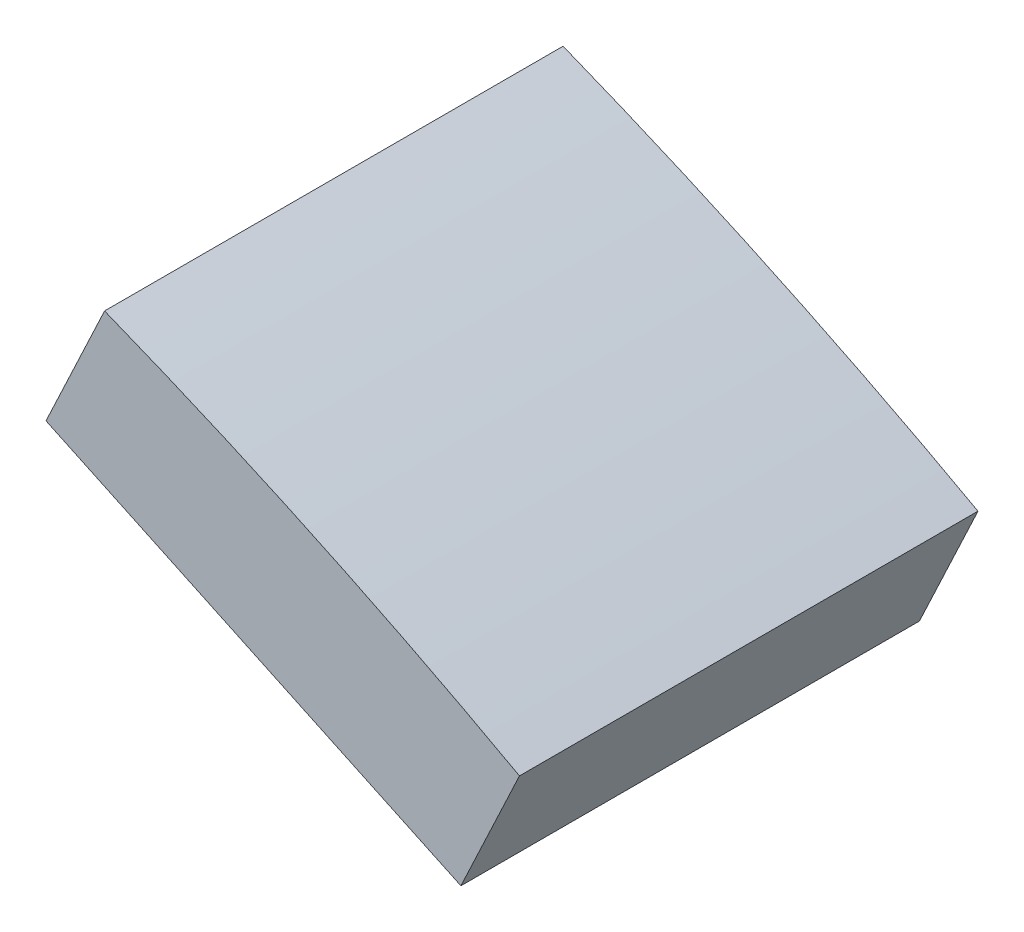
ISO-10303-21;
HEADER;
FILE_DESCRIPTION(('STEP AP214'),'2;1');
FILE_NAME('part.step','',(''),(''),'','','');
FILE_SCHEMA(('AUTOMOTIVE_DESIGN { 1 0 10303 214 1 1 1 1 }'));
ENDSEC;
DATA;
#1=APPLICATION_CONTEXT('core data for automotive mechanical design processes');
#2=APPLICATION_PROTOCOL_DEFINITION('international standard','automotive_design',2000,#1);
#3=PRODUCT_CONTEXT('',#1,'mechanical');
#4=PRODUCT('Part','Part','',(#3));
#5=PRODUCT_RELATED_PRODUCT_CATEGORY('part','',(#4));
#6=PRODUCT_DEFINITION_FORMATION('','',#4);
#7=PRODUCT_DEFINITION_CONTEXT('part definition',#1,'design');
#8=PRODUCT_DEFINITION('design','',#6,#7);
#9=PRODUCT_DEFINITION_SHAPE('','',#8);
#10=(LENGTH_UNIT() NAMED_UNIT(*) SI_UNIT(.MILLI.,.METRE.));
#11=(NAMED_UNIT(*) PLANE_ANGLE_UNIT() SI_UNIT($,.RADIAN.));
#12=(NAMED_UNIT(*) SI_UNIT($,.STERADIAN.) SOLID_ANGLE_UNIT());
#13=UNCERTAINTY_MEASURE_WITH_UNIT(LENGTH_MEASURE(1.E-05),#10,'distance_accuracy_value','');
#14=(GEOMETRIC_REPRESENTATION_CONTEXT(3) GLOBAL_UNCERTAINTY_ASSIGNED_CONTEXT((#13)) GLOBAL_UNIT_ASSIGNED_CONTEXT((#10,
#11,#12)) REPRESENTATION_CONTEXT('',''));
#15=CARTESIAN_POINT('',(0.,0.,0.));
#16=DIRECTION('',(0.,0.,1.));
#17=DIRECTION('',(1.,0.,0.));
#18=AXIS2_PLACEMENT_3D('',#15,#16,#17);
#19=CARTESIAN_POINT('',(0.,0.,12.7));
#20=DIRECTION('',(0.,0.,-1.));
#21=DIRECTION('',(-1.,0.,0.));
#22=AXIS2_PLACEMENT_3D('',#19,#20,#21);
#23=CYLINDRICAL_SURFACE('',#22,101.6);
#24=CARTESIAN_POINT('',(0.,0.,0.));
#25=DIRECTION('',(0.,0.,1.));
#26=DIRECTION('',(-1.,0.,0.));
#27=AXIS2_PLACEMENT_3D('',#24,#25,#26);
#28=CIRCLE('',#27,101.6);
#29=CARTESIAN_POINT('',(48.9158522480333,89.0494211033883,0.));
#30=VERTEX_POINT('',#29);
#31=CARTESIAN_POINT('',(37.4242813683509,94.45625,0.));
#32=VERTEX_POINT('',#31);
#33=EDGE_CURVE('E96',#30,#32,#28,.T.);
#34=ORIENTED_EDGE('',*,*,#33,.T.);
#35=DIRECTION('',(0.,0.,-1.));
#36=VECTOR('',#35,1.);
#37=CARTESIAN_POINT('',(37.4242813683509,94.45625,12.7));
#38=LINE('',#37,#36);
#39=CARTESIAN_POINT('',(37.4242813683509,94.45625,12.7));
#40=VERTEX_POINT('',#39);
#41=EDGE_CURVE('E11',#40,#32,#38,.T.);
#42=ORIENTED_EDGE('',*,*,#41,.F.);
#43=CARTESIAN_POINT('',(0.,0.,12.7));
#44=DIRECTION('',(0.,0.,1.));
#45=DIRECTION('',(-1.,0.,0.));
#46=AXIS2_PLACEMENT_3D('',#43,#44,#45);
#47=CIRCLE('',#46,101.6);
#48=CARTESIAN_POINT('',(48.9158522480333,89.0494211033883,12.7));
#49=VERTEX_POINT('',#48);
#50=EDGE_CURVE('E84',#49,#40,#47,.T.);
#51=ORIENTED_EDGE('',*,*,#50,.F.);
#52=DIRECTION('',(0.,0.,-1.));
#53=VECTOR('',#52,1.);
#54=CARTESIAN_POINT('',(48.9158522480333,89.0494211033883,12.7));
#55=LINE('',#54,#53);
#56=EDGE_CURVE('E92',#49,#30,#55,.T.);
#57=ORIENTED_EDGE('',*,*,#56,.T.);
#58=EDGE_LOOP('',(#34,#42,#51,#57));
#59=FACE_BOUND('',#58,.T.);
#60=ADVANCED_FACE('F33',(#59),#23,.T.);
#61=CARTESIAN_POINT('',(37.4242813683509,94.45625,12.7));
#62=DIRECTION('',(0.904848100762394,-0.425734558788324,0.));
#63=DIRECTION('',(0.425734558788324,0.904848100762394,0.));
#64=AXIS2_PLACEMENT_3D('',#61,#62,#63);
#65=PLANE('',#64);
#66=DIRECTION('',(-0.425734558788324,-0.904848100762394,0.));
#67=VECTOR('',#66,1.);
#68=CARTESIAN_POINT('',(37.4242813683509,94.45625,0.));
#69=LINE('',#68,#67);
#70=CARTESIAN_POINT('',(35.8022326993674,91.0087787360953,0.));
#71=VERTEX_POINT('',#70);
#72=EDGE_CURVE('E88',#32,#71,#69,.T.);
#73=ORIENTED_EDGE('',*,*,#72,.T.);
#74=DIRECTION('',(0.,0.,-1.));
#75=VECTOR('',#74,1.);
#76=CARTESIAN_POINT('',(35.8022326993674,91.0087787360953,12.7));
#77=LINE('',#76,#75);
#78=CARTESIAN_POINT('',(35.8022326993674,91.0087787360953,12.7));
#79=VERTEX_POINT('',#78);
#80=EDGE_CURVE('E41',#79,#71,#77,.T.);
#81=ORIENTED_EDGE('',*,*,#80,.F.);
#82=DIRECTION('',(-0.425734558788324,-0.904848100762394,0.));
#83=VECTOR('',#82,1.);
#84=CARTESIAN_POINT('',(37.4242813683509,94.45625,12.7));
#85=LINE('',#84,#83);
#86=EDGE_CURVE('E79',#40,#79,#85,.T.);
#87=ORIENTED_EDGE('',*,*,#86,.F.);
#88=ORIENTED_EDGE('',*,*,#41,.T.);
#89=EDGE_LOOP('',(#73,#81,#87,#88));
#90=FACE_BOUND('',#89,.T.);
#91=ADVANCED_FACE('F87',(#90),#65,.F.);
#92=CARTESIAN_POINT('',(35.8022326993674,91.0087787360953,12.7));
#93=DIRECTION('',(0.425734558788324,0.904848100762394,0.));
#94=DIRECTION('',(-0.904848100762394,0.425734558788324,0.));
#95=AXIS2_PLACEMENT_3D('',#92,#93,#94);
#96=PLANE('',#95);
#97=DIRECTION('',(0.904848100762394,-0.425734558788324,0.));
#98=VECTOR('',#97,1.);
#99=CARTESIAN_POINT('',(35.8022326993674,91.0087787360953,0.));
#100=LINE('',#99,#98);
#101=CARTESIAN_POINT('',(47.2938035790498,85.6019498394836,0.));
#102=VERTEX_POINT('',#101);
#103=EDGE_CURVE('E66',#71,#102,#100,.T.);
#104=ORIENTED_EDGE('',*,*,#103,.T.);
#105=DIRECTION('',(0.,0.,-1.));
#106=VECTOR('',#105,1.);
#107=CARTESIAN_POINT('',(47.2938035790498,85.6019498394836,12.7));
#108=LINE('',#107,#106);
#109=CARTESIAN_POINT('',(47.2938035790498,85.6019498394836,12.7));
#110=VERTEX_POINT('',#109);
#111=EDGE_CURVE('E89',#110,#102,#108,.T.);
#112=ORIENTED_EDGE('',*,*,#111,.F.);
#113=DIRECTION('',(0.904848100762394,-0.425734558788324,0.));
#114=VECTOR('',#113,1.);
#115=CARTESIAN_POINT('',(35.8022326993674,91.0087787360953,12.7));
#116=LINE('',#115,#114);
#117=EDGE_CURVE('E82',#79,#110,#116,.T.);
#118=ORIENTED_EDGE('',*,*,#117,.F.);
#119=ORIENTED_EDGE('',*,*,#80,.T.);
#120=EDGE_LOOP('',(#104,#112,#118,#119));
#121=FACE_BOUND('',#120,.T.);
#122=ADVANCED_FACE('F90',(#121),#96,.F.);
#123=CARTESIAN_POINT('',(47.2938035790498,85.6019498394836,12.7));
#124=DIRECTION('',(-0.904848100762394,0.425734558788324,0.));
#125=DIRECTION('',(-0.425734558788324,-0.904848100762394,0.));
#126=AXIS2_PLACEMENT_3D('',#123,#124,#125);
#127=PLANE('',#126);
#128=DIRECTION('',(0.425734558788324,0.904848100762394,0.));
#129=VECTOR('',#128,1.);
#130=CARTESIAN_POINT('',(47.2938035790498,85.6019498394836,0.));
#131=LINE('',#130,#129);
#132=EDGE_CURVE('E72',#102,#30,#131,.T.);
#133=ORIENTED_EDGE('',*,*,#132,.T.);
#134=ORIENTED_EDGE('',*,*,#56,.F.);
#135=DIRECTION('',(0.425734558788324,0.904848100762394,0.));
#136=VECTOR('',#135,1.);
#137=CARTESIAN_POINT('',(47.2938035790498,85.6019498394836,12.7));
#138=LINE('',#137,#136);
#139=EDGE_CURVE('E49',#110,#49,#138,.T.);
#140=ORIENTED_EDGE('',*,*,#139,.F.);
#141=ORIENTED_EDGE('',*,*,#111,.T.);
#142=EDGE_LOOP('',(#133,#134,#140,#141));
#143=FACE_BOUND('',#142,.T.);
#144=ADVANCED_FACE('F103',(#143),#127,.F.);
#145=CARTESIAN_POINT('',(0.,0.,12.7));
#146=DIRECTION('',(0.,0.,-1.));
#147=DIRECTION('',(-1.,0.,0.));
#148=AXIS2_PLACEMENT_3D('',#145,#146,#147);
#149=PLANE('',#148);
#150=ORIENTED_EDGE('',*,*,#50,.T.);
#151=ORIENTED_EDGE('',*,*,#86,.T.);
#152=ORIENTED_EDGE('',*,*,#117,.T.);
#153=ORIENTED_EDGE('',*,*,#139,.T.);
#154=EDGE_LOOP('',(#150,#151,#152,#153));
#155=FACE_BOUND('',#154,.T.);
#156=ADVANCED_FACE('F80',(#155),#149,.F.);
#157=CARTESIAN_POINT('',(0.,0.,0.));
#158=DIRECTION('',(0.,0.,-1.));
#159=DIRECTION('',(-1.,0.,0.));
#160=AXIS2_PLACEMENT_3D('',#157,#158,#159);
#161=PLANE('',#160);
#162=ORIENTED_EDGE('',*,*,#33,.F.);
#163=ORIENTED_EDGE('',*,*,#132,.F.);
#164=ORIENTED_EDGE('',*,*,#103,.F.);
#165=ORIENTED_EDGE('',*,*,#72,.F.);
#166=EDGE_LOOP('',(#162,#163,#164,#165));
#167=FACE_BOUND('',#166,.T.);
#168=ADVANCED_FACE('F106',(#167),#161,.T.);
#169=CLOSED_SHELL('',(#60,#91,#122,#144,#156,#168));
#170=MANIFOLD_SOLID_BREP('B2',#169);
#171=ADVANCED_BREP_SHAPE_REPRESENTATION('',(#18,#170),#14);
#172=SHAPE_DEFINITION_REPRESENTATION(#9,#171);
ENDSEC;
END-ISO-10303-21;
